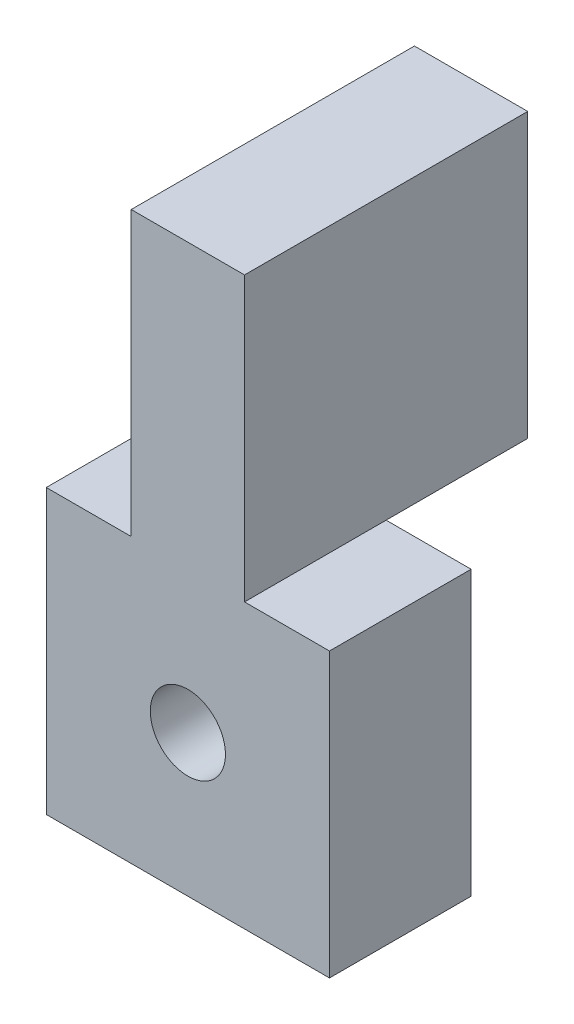
ISO-10303-21;
HEADER;
FILE_DESCRIPTION(('STEP AP214'),'2;1');
FILE_NAME('part.step','',(''),(''),'','','');
FILE_SCHEMA(('AUTOMOTIVE_DESIGN { 1 0 10303 214 1 1 1 1 }'));
ENDSEC;
DATA;
#1=APPLICATION_CONTEXT('core data for automotive mechanical design processes');
#2=APPLICATION_PROTOCOL_DEFINITION('international standard','automotive_design',2000,#1);
#3=PRODUCT_CONTEXT('',#1,'mechanical');
#4=PRODUCT('Part','Part','',(#3));
#5=PRODUCT_RELATED_PRODUCT_CATEGORY('part','',(#4));
#6=PRODUCT_DEFINITION_FORMATION('','',#4);
#7=PRODUCT_DEFINITION_CONTEXT('part definition',#1,'design');
#8=PRODUCT_DEFINITION('design','',#6,#7);
#9=PRODUCT_DEFINITION_SHAPE('','',#8);
#10=(LENGTH_UNIT() NAMED_UNIT(*) SI_UNIT(.MILLI.,.METRE.));
#11=(NAMED_UNIT(*) PLANE_ANGLE_UNIT() SI_UNIT($,.RADIAN.));
#12=(NAMED_UNIT(*) SI_UNIT($,.STERADIAN.) SOLID_ANGLE_UNIT());
#13=UNCERTAINTY_MEASURE_WITH_UNIT(LENGTH_MEASURE(1.E-05),#10,'distance_accuracy_value','');
#14=(GEOMETRIC_REPRESENTATION_CONTEXT(3) GLOBAL_UNCERTAINTY_ASSIGNED_CONTEXT((#13)) GLOBAL_UNIT_ASSIGNED_CONTEXT((#10,
#11,#12)) REPRESENTATION_CONTEXT('',''));
#15=CARTESIAN_POINT('',(0.,0.,0.));
#16=DIRECTION('',(0.,0.,1.));
#17=DIRECTION('',(1.,0.,0.));
#18=AXIS2_PLACEMENT_3D('',#15,#16,#17);
#19=CARTESIAN_POINT('',(10.,0.,10.));
#20=DIRECTION('',(1.,0.,0.));
#21=DIRECTION('',(0.,1.,0.));
#22=AXIS2_PLACEMENT_3D('',#19,#20,#21);
#23=PLANE('',#22);
#24=DIRECTION('',(0.,-1.,0.));
#25=VECTOR('',#24,1.);
#26=CARTESIAN_POINT('',(10.,0.,0.));
#27=LINE('',#26,#25);
#28=CARTESIAN_POINT('',(10.,10.,0.));
#29=VERTEX_POINT('',#28);
#30=CARTESIAN_POINT('',(10.,-10.,0.));
#31=VERTEX_POINT('',#30);
#32=EDGE_CURVE('E157',#29,#31,#27,.T.);
#33=ORIENTED_EDGE('',*,*,#32,.F.);
#34=DIRECTION('',(0.,0.,-1.));
#35=VECTOR('',#34,1.);
#36=CARTESIAN_POINT('',(10.,10.,10.));
#37=LINE('',#36,#35);
#38=CARTESIAN_POINT('',(10.,10.,10.));
#39=VERTEX_POINT('',#38);
#40=EDGE_CURVE('E11',#39,#29,#37,.T.);
#41=ORIENTED_EDGE('',*,*,#40,.F.);
#42=DIRECTION('',(0.,-1.,0.));
#43=VECTOR('',#42,1.);
#44=CARTESIAN_POINT('',(10.,0.,10.));
#45=LINE('',#44,#43);
#46=CARTESIAN_POINT('',(10.,-10.,10.));
#47=VERTEX_POINT('',#46);
#48=EDGE_CURVE('E143',#39,#47,#45,.T.);
#49=ORIENTED_EDGE('',*,*,#48,.T.);
#50=DIRECTION('',(0.,0.,-1.));
#51=VECTOR('',#50,1.);
#52=CARTESIAN_POINT('',(10.,-10.,10.));
#53=LINE('',#52,#51);
#54=EDGE_CURVE('E88',#47,#31,#53,.T.);
#55=ORIENTED_EDGE('',*,*,#54,.T.);
#56=EDGE_LOOP('',(#33,#41,#49,#55));
#57=FACE_BOUND('',#56,.T.);
#58=ADVANCED_FACE('F45',(#57),#23,.T.);
#59=CARTESIAN_POINT('',(0.,10.,10.));
#60=DIRECTION('',(0.,1.,0.));
#61=DIRECTION('',(0.,0.,1.));
#62=AXIS2_PLACEMENT_3D('',#59,#60,#61);
#63=PLANE('',#62);
#64=DIRECTION('',(1.,0.,0.));
#65=VECTOR('',#64,1.);
#66=CARTESIAN_POINT('',(0.,10.,0.));
#67=LINE('',#66,#65);
#68=CARTESIAN_POINT('',(4.,10.,0.));
#69=VERTEX_POINT('',#68);
#70=EDGE_CURVE('E233',#69,#29,#67,.T.);
#71=ORIENTED_EDGE('',*,*,#70,.F.);
#72=DIRECTION('',(0.,0.,-1.));
#73=VECTOR('',#72,1.);
#74=CARTESIAN_POINT('',(4.,10.,10.));
#75=LINE('',#74,#73);
#76=CARTESIAN_POINT('',(4.,10.,10.));
#77=VERTEX_POINT('',#76);
#78=EDGE_CURVE('E54',#77,#69,#75,.T.);
#79=ORIENTED_EDGE('',*,*,#78,.F.);
#80=DIRECTION('',(1.,0.,0.));
#81=VECTOR('',#80,1.);
#82=CARTESIAN_POINT('',(0.,10.,10.));
#83=LINE('',#82,#81);
#84=EDGE_CURVE('E134',#77,#39,#83,.T.);
#85=ORIENTED_EDGE('',*,*,#84,.T.);
#86=ORIENTED_EDGE('',*,*,#40,.T.);
#87=EDGE_LOOP('',(#71,#79,#85,#86));
#88=FACE_BOUND('',#87,.T.);
#89=ADVANCED_FACE('F247',(#88),#63,.T.);
#90=CARTESIAN_POINT('',(4.,0.,10.));
#91=DIRECTION('',(1.,0.,0.));
#92=DIRECTION('',(0.,1.,0.));
#93=AXIS2_PLACEMENT_3D('',#90,#91,#92);
#94=PLANE('',#93);
#95=ORIENTED_EDGE('',*,*,#78,.T.);
#96=DIRECTION('',(0.,0.,1.));
#97=VECTOR('',#96,1.);
#98=CARTESIAN_POINT('',(4.,10.,-10.));
#99=LINE('',#98,#97);
#100=CARTESIAN_POINT('',(4.,10.,-10.));
#101=VERTEX_POINT('',#100);
#102=EDGE_CURVE('E162',#101,#69,#99,.T.);
#103=ORIENTED_EDGE('',*,*,#102,.F.);
#104=DIRECTION('',(0.,-1.,0.));
#105=VECTOR('',#104,1.);
#106=CARTESIAN_POINT('',(4.,0.,-10.));
#107=LINE('',#106,#105);
#108=CARTESIAN_POINT('',(4.,30.,-10.));
#109=VERTEX_POINT('',#108);
#110=EDGE_CURVE('E174',#109,#101,#107,.T.);
#111=ORIENTED_EDGE('',*,*,#110,.F.);
#112=DIRECTION('',(0.,0.,-1.));
#113=VECTOR('',#112,1.);
#114=CARTESIAN_POINT('',(4.,30.,10.));
#115=LINE('',#114,#113);
#116=CARTESIAN_POINT('',(4.,30.,10.));
#117=VERTEX_POINT('',#116);
#118=EDGE_CURVE('E216',#117,#109,#115,.T.);
#119=ORIENTED_EDGE('',*,*,#118,.F.);
#120=DIRECTION('',(0.,-1.,0.));
#121=VECTOR('',#120,1.);
#122=CARTESIAN_POINT('',(4.,0.,10.));
#123=LINE('',#122,#121);
#124=EDGE_CURVE('E142',#117,#77,#123,.T.);
#125=ORIENTED_EDGE('',*,*,#124,.T.);
#126=EDGE_LOOP('',(#95,#103,#111,#119,#125));
#127=FACE_BOUND('',#126,.T.);
#128=ADVANCED_FACE('F199',(#127),#94,.T.);
#129=CARTESIAN_POINT('',(0.,30.,10.));
#130=DIRECTION('',(0.,1.,0.));
#131=DIRECTION('',(0.,0.,1.));
#132=AXIS2_PLACEMENT_3D('',#129,#130,#131);
#133=PLANE('',#132);
#134=ORIENTED_EDGE('',*,*,#118,.T.);
#135=DIRECTION('',(1.,0.,0.));
#136=VECTOR('',#135,1.);
#137=CARTESIAN_POINT('',(0.,30.,-10.));
#138=LINE('',#137,#136);
#139=CARTESIAN_POINT('',(-4.,30.,-10.));
#140=VERTEX_POINT('',#139);
#141=EDGE_CURVE('E182',#140,#109,#138,.T.);
#142=ORIENTED_EDGE('',*,*,#141,.F.);
#143=DIRECTION('',(0.,0.,-1.));
#144=VECTOR('',#143,1.);
#145=CARTESIAN_POINT('',(-4.,30.,10.));
#146=LINE('',#145,#144);
#147=CARTESIAN_POINT('',(-4.,30.,10.));
#148=VERTEX_POINT('',#147);
#149=EDGE_CURVE('E210',#148,#140,#146,.T.);
#150=ORIENTED_EDGE('',*,*,#149,.F.);
#151=DIRECTION('',(1.,0.,0.));
#152=VECTOR('',#151,1.);
#153=CARTESIAN_POINT('',(0.,30.,10.));
#154=LINE('',#153,#152);
#155=EDGE_CURVE('E136',#148,#117,#154,.T.);
#156=ORIENTED_EDGE('',*,*,#155,.T.);
#157=EDGE_LOOP('',(#134,#142,#150,#156));
#158=FACE_BOUND('',#157,.T.);
#159=ADVANCED_FACE('F217',(#158),#133,.T.);
#160=CARTESIAN_POINT('',(-4.,0.,10.));
#161=DIRECTION('',(1.,0.,0.));
#162=DIRECTION('',(0.,1.,0.));
#163=AXIS2_PLACEMENT_3D('',#160,#161,#162);
#164=PLANE('',#163);
#165=ORIENTED_EDGE('',*,*,#149,.T.);
#166=DIRECTION('',(0.,-1.,0.));
#167=VECTOR('',#166,1.);
#168=CARTESIAN_POINT('',(-4.,0.,-10.));
#169=LINE('',#168,#167);
#170=CARTESIAN_POINT('',(-4.,10.,-10.));
#171=VERTEX_POINT('',#170);
#172=EDGE_CURVE('E178',#140,#171,#169,.T.);
#173=ORIENTED_EDGE('',*,*,#172,.T.);
#174=DIRECTION('',(0.,0.,1.));
#175=VECTOR('',#174,1.);
#176=CARTESIAN_POINT('',(-4.,10.,-10.));
#177=LINE('',#176,#175);
#178=CARTESIAN_POINT('',(-4.,10.,0.));
#179=VERTEX_POINT('',#178);
#180=EDGE_CURVE('E163',#171,#179,#177,.T.);
#181=ORIENTED_EDGE('',*,*,#180,.T.);
#182=DIRECTION('',(0.,0.,-1.));
#183=VECTOR('',#182,1.);
#184=CARTESIAN_POINT('',(-4.,10.,10.));
#185=LINE('',#184,#183);
#186=CARTESIAN_POINT('',(-4.,10.,10.));
#187=VERTEX_POINT('',#186);
#188=EDGE_CURVE('E120',#187,#179,#185,.T.);
#189=ORIENTED_EDGE('',*,*,#188,.F.);
#190=DIRECTION('',(0.,-1.,0.));
#191=VECTOR('',#190,1.);
#192=CARTESIAN_POINT('',(-4.,0.,10.));
#193=LINE('',#192,#191);
#194=EDGE_CURVE('E130',#148,#187,#193,.T.);
#195=ORIENTED_EDGE('',*,*,#194,.F.);
#196=EDGE_LOOP('',(#165,#173,#181,#189,#195));
#197=FACE_BOUND('',#196,.T.);
#198=ADVANCED_FACE('F209',(#197),#164,.F.);
#199=CARTESIAN_POINT('',(-10.,10.,0.));
#200=VERTEX_POINT('',#199);
#201=EDGE_CURVE('E118',#200,#179,#67,.T.);
#202=ORIENTED_EDGE('',*,*,#201,.F.);
#203=DIRECTION('',(0.,0.,-1.));
#204=VECTOR('',#203,1.);
#205=CARTESIAN_POINT('',(-10.,10.,10.));
#206=LINE('',#205,#204);
#207=CARTESIAN_POINT('',(-10.,10.,10.));
#208=VERTEX_POINT('',#207);
#209=EDGE_CURVE('E111',#208,#200,#206,.T.);
#210=ORIENTED_EDGE('',*,*,#209,.F.);
#211=EDGE_CURVE('E116',#208,#187,#83,.T.);
#212=ORIENTED_EDGE('',*,*,#211,.T.);
#213=ORIENTED_EDGE('',*,*,#188,.T.);
#214=EDGE_LOOP('',(#202,#210,#212,#213));
#215=FACE_BOUND('',#214,.T.);
#216=ADVANCED_FACE('F113',(#215),#63,.T.);
#217=CARTESIAN_POINT('',(-10.,0.,10.));
#218=DIRECTION('',(1.,0.,0.));
#219=DIRECTION('',(0.,0.,-1.));
#220=AXIS2_PLACEMENT_3D('',#217,#218,#219);
#221=PLANE('',#220);
#222=DIRECTION('',(0.,-1.,0.));
#223=VECTOR('',#222,1.);
#224=CARTESIAN_POINT('',(-10.,0.,0.));
#225=LINE('',#224,#223);
#226=CARTESIAN_POINT('',(-10.,-10.,0.));
#227=VERTEX_POINT('',#226);
#228=EDGE_CURVE('E81',#200,#227,#225,.T.);
#229=ORIENTED_EDGE('',*,*,#228,.T.);
#230=DIRECTION('',(0.,0.,-1.));
#231=VECTOR('',#230,1.);
#232=CARTESIAN_POINT('',(-10.,-10.,10.));
#233=LINE('',#232,#231);
#234=CARTESIAN_POINT('',(-10.,-10.,10.));
#235=VERTEX_POINT('',#234);
#236=EDGE_CURVE('E121',#235,#227,#233,.T.);
#237=ORIENTED_EDGE('',*,*,#236,.F.);
#238=DIRECTION('',(0.,-1.,0.));
#239=VECTOR('',#238,1.);
#240=CARTESIAN_POINT('',(-10.,0.,10.));
#241=LINE('',#240,#239);
#242=EDGE_CURVE('E123',#208,#235,#241,.T.);
#243=ORIENTED_EDGE('',*,*,#242,.F.);
#244=ORIENTED_EDGE('',*,*,#209,.T.);
#245=EDGE_LOOP('',(#229,#237,#243,#244));
#246=FACE_BOUND('',#245,.T.);
#247=ADVANCED_FACE('F124',(#246),#221,.F.);
#248=CARTESIAN_POINT('',(0.,-10.,10.));
#249=DIRECTION('',(0.,1.,0.));
#250=DIRECTION('',(0.,0.,1.));
#251=AXIS2_PLACEMENT_3D('',#248,#249,#250);
#252=PLANE('',#251);
#253=DIRECTION('',(1.,0.,0.));
#254=VECTOR('',#253,1.);
#255=CARTESIAN_POINT('',(0.,-10.,0.));
#256=LINE('',#255,#254);
#257=EDGE_CURVE('E149',#227,#31,#256,.T.);
#258=ORIENTED_EDGE('',*,*,#257,.T.);
#259=ORIENTED_EDGE('',*,*,#54,.F.);
#260=DIRECTION('',(1.,0.,0.));
#261=VECTOR('',#260,1.);
#262=CARTESIAN_POINT('',(0.,-10.,10.));
#263=LINE('',#262,#261);
#264=EDGE_CURVE('E62',#235,#47,#263,.T.);
#265=ORIENTED_EDGE('',*,*,#264,.F.);
#266=ORIENTED_EDGE('',*,*,#236,.T.);
#267=EDGE_LOOP('',(#258,#259,#265,#266));
#268=FACE_BOUND('',#267,.T.);
#269=ADVANCED_FACE('F264',(#268),#252,.F.);
#270=CARTESIAN_POINT('',(0.,0.,10.));
#271=DIRECTION('',(0.,0.,1.));
#272=DIRECTION('',(1.,0.,0.));
#273=AXIS2_PLACEMENT_3D('',#270,#271,#272);
#274=PLANE('',#273);
#275=CARTESIAN_POINT('',(0.,0.,10.));
#276=DIRECTION('',(0.,0.,1.));
#277=DIRECTION('',(1.,0.,0.));
#278=AXIS2_PLACEMENT_3D('',#275,#276,#277);
#279=CIRCLE('',#278,2.65429999999998);
#280=CARTESIAN_POINT('',(2.65429999999998,0.,10.));
#281=VERTEX_POINT('',#280);
#282=EDGE_CURVE('E158',#281,#281,#279,.T.);
#283=ORIENTED_EDGE('',*,*,#282,.F.);
#284=EDGE_LOOP('',(#283));
#285=FACE_BOUND('',#284,.T.);
#286=ORIENTED_EDGE('',*,*,#48,.F.);
#287=ORIENTED_EDGE('',*,*,#84,.F.);
#288=ORIENTED_EDGE('',*,*,#124,.F.);
#289=ORIENTED_EDGE('',*,*,#155,.F.);
#290=ORIENTED_EDGE('',*,*,#194,.T.);
#291=ORIENTED_EDGE('',*,*,#211,.F.);
#292=ORIENTED_EDGE('',*,*,#242,.T.);
#293=ORIENTED_EDGE('',*,*,#264,.T.);
#294=EDGE_LOOP('',(#286,#287,#288,#289,#290,#291,#292,#293));
#295=FACE_BOUND('',#294,.T.);
#296=ADVANCED_FACE('F127',(#285,#295),#274,.T.);
#297=CARTESIAN_POINT('',(0.,0.,0.));
#298=DIRECTION('',(0.,0.,1.));
#299=DIRECTION('',(1.,0.,0.));
#300=AXIS2_PLACEMENT_3D('',#297,#298,#299);
#301=PLANE('',#300);
#302=CARTESIAN_POINT('',(0.,0.,0.));
#303=DIRECTION('',(0.,0.,1.));
#304=DIRECTION('',(1.,0.,0.));
#305=AXIS2_PLACEMENT_3D('',#302,#303,#304);
#306=CIRCLE('',#305,2.65429999999998);
#307=CARTESIAN_POINT('',(2.65429999999998,0.,0.));
#308=VERTEX_POINT('',#307);
#309=EDGE_CURVE('E153',#308,#308,#306,.T.);
#310=ORIENTED_EDGE('',*,*,#309,.T.);
#311=EDGE_LOOP('',(#310));
#312=FACE_BOUND('',#311,.T.);
#313=ORIENTED_EDGE('',*,*,#201,.T.);
#314=DIRECTION('',(1.,0.,0.));
#315=VECTOR('',#314,1.);
#316=CARTESIAN_POINT('',(0.,10.,0.));
#317=LINE('',#316,#315);
#318=EDGE_CURVE('E170',#179,#69,#317,.T.);
#319=ORIENTED_EDGE('',*,*,#318,.T.);
#320=ORIENTED_EDGE('',*,*,#70,.T.);
#321=ORIENTED_EDGE('',*,*,#32,.T.);
#322=ORIENTED_EDGE('',*,*,#257,.F.);
#323=ORIENTED_EDGE('',*,*,#228,.F.);
#324=EDGE_LOOP('',(#313,#319,#320,#321,#322,#323));
#325=FACE_BOUND('',#324,.T.);
#326=ADVANCED_FACE('F245',(#312,#325),#301,.F.);
#327=CARTESIAN_POINT('',(0.,0.,10.));
#328=DIRECTION('',(0.,0.,1.));
#329=DIRECTION('',(1.,0.,0.));
#330=AXIS2_PLACEMENT_3D('',#327,#328,#329);
#331=CYLINDRICAL_SURFACE('',#330,2.65429999999998);
#332=ORIENTED_EDGE('',*,*,#309,.F.);
#333=EDGE_LOOP('',(#332));
#334=FACE_BOUND('',#333,.T.);
#335=ORIENTED_EDGE('',*,*,#282,.T.);
#336=EDGE_LOOP('',(#335));
#337=FACE_BOUND('',#336,.T.);
#338=ADVANCED_FACE('F283',(#334,#337),#331,.F.);
#339=CARTESIAN_POINT('',(0.,10.,-10.));
#340=DIRECTION('',(0.,-1.,0.));
#341=DIRECTION('',(0.,0.,-1.));
#342=AXIS2_PLACEMENT_3D('',#339,#340,#341);
#343=PLANE('',#342);
#344=ORIENTED_EDGE('',*,*,#318,.F.);
#345=ORIENTED_EDGE('',*,*,#180,.F.);
#346=DIRECTION('',(1.,0.,0.));
#347=VECTOR('',#346,1.);
#348=CARTESIAN_POINT('',(0.,10.,-10.));
#349=LINE('',#348,#347);
#350=EDGE_CURVE('E167',#171,#101,#349,.T.);
#351=ORIENTED_EDGE('',*,*,#350,.T.);
#352=ORIENTED_EDGE('',*,*,#102,.T.);
#353=EDGE_LOOP('',(#344,#345,#351,#352));
#354=FACE_BOUND('',#353,.T.);
#355=ADVANCED_FACE('F204',(#354),#343,.T.);
#356=CARTESIAN_POINT('',(0.,0.,-10.));
#357=DIRECTION('',(0.,0.,1.));
#358=DIRECTION('',(1.,0.,0.));
#359=AXIS2_PLACEMENT_3D('',#356,#357,#358);
#360=PLANE('',#359);
#361=ORIENTED_EDGE('',*,*,#110,.T.);
#362=ORIENTED_EDGE('',*,*,#350,.F.);
#363=ORIENTED_EDGE('',*,*,#172,.F.);
#364=ORIENTED_EDGE('',*,*,#141,.T.);
#365=EDGE_LOOP('',(#361,#362,#363,#364));
#366=FACE_BOUND('',#365,.T.);
#367=ADVANCED_FACE('F192',(#366),#360,.F.);
#368=CLOSED_SHELL('',(#58,#89,#128,#159,#198,#216,#247,#269,#296,#326,#338,#355,#367));
#369=MANIFOLD_SOLID_BREP('B2',#368);
#370=ADVANCED_BREP_SHAPE_REPRESENTATION('',(#18,#369),#14);
#371=SHAPE_DEFINITION_REPRESENTATION(#9,#370);
ENDSEC;
END-ISO-10303-21;
